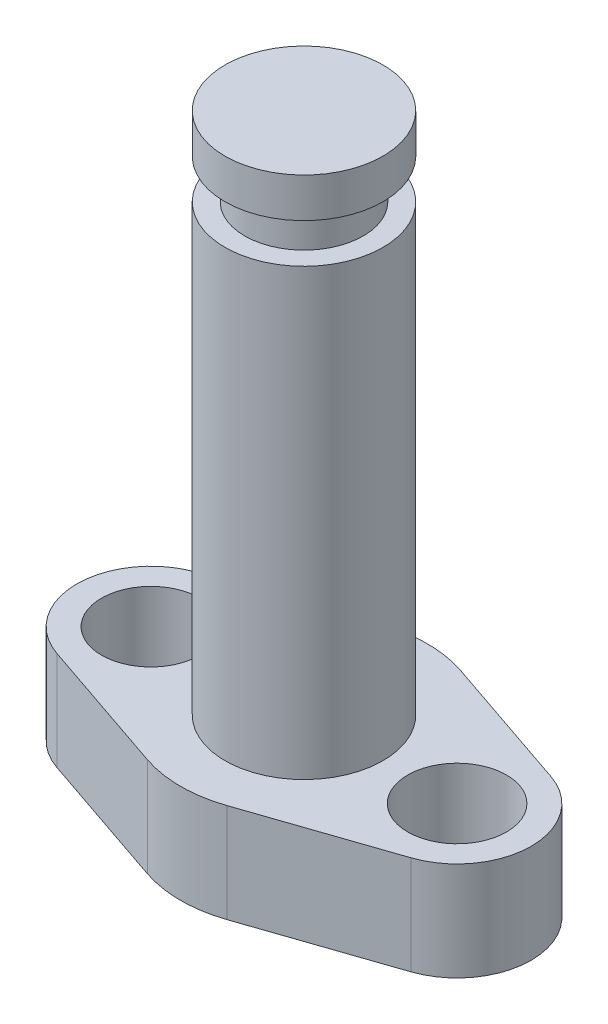
ISO-10303-21;
HEADER;
FILE_DESCRIPTION(('STEP AP214'),'2;1');
FILE_NAME('part.step','',(''),(''),'','','');
FILE_SCHEMA(('AUTOMOTIVE_DESIGN { 1 0 10303 214 1 1 1 1 }'));
ENDSEC;
DATA;
#1=APPLICATION_CONTEXT('core data for automotive mechanical design processes');
#2=APPLICATION_PROTOCOL_DEFINITION('international standard','automotive_design',2000,#1);
#3=PRODUCT_CONTEXT('',#1,'mechanical');
#4=PRODUCT('Part','Part','',(#3));
#5=PRODUCT_RELATED_PRODUCT_CATEGORY('part','',(#4));
#6=PRODUCT_DEFINITION_FORMATION('','',#4);
#7=PRODUCT_DEFINITION_CONTEXT('part definition',#1,'design');
#8=PRODUCT_DEFINITION('design','',#6,#7);
#9=PRODUCT_DEFINITION_SHAPE('','',#8);
#10=(LENGTH_UNIT() NAMED_UNIT(*) SI_UNIT(.MILLI.,.METRE.));
#11=(NAMED_UNIT(*) PLANE_ANGLE_UNIT() SI_UNIT($,.RADIAN.));
#12=(NAMED_UNIT(*) SI_UNIT($,.STERADIAN.) SOLID_ANGLE_UNIT());
#13=UNCERTAINTY_MEASURE_WITH_UNIT(LENGTH_MEASURE(1.E-05),#10,'distance_accuracy_value','');
#14=(GEOMETRIC_REPRESENTATION_CONTEXT(3) GLOBAL_UNCERTAINTY_ASSIGNED_CONTEXT((#13)) GLOBAL_UNIT_ASSIGNED_CONTEXT((#10,
#11,#12)) REPRESENTATION_CONTEXT('',''));
#15=CARTESIAN_POINT('',(0.,0.,0.));
#16=DIRECTION('',(0.,0.,1.));
#17=DIRECTION('',(1.,0.,0.));
#18=AXIS2_PLACEMENT_3D('',#15,#16,#17);
#19=CARTESIAN_POINT('',(-2.01612903225806,5.,5.91588739964565));
#20=DIRECTION('',(0.32258064516129,0.,-0.946541983943304));
#21=DIRECTION('',(-0.946541983943304,0.,-0.32258064516129));
#22=AXIS2_PLACEMENT_3D('',#19,#20,#21);
#23=PLANE('',#22);
#24=DIRECTION('',(0.946541983943304,0.,0.32258064516129));
#25=VECTOR('',#24,1.);
#26=CARTESIAN_POINT('',(-2.01612903225806,0.,5.91588739964565));
#27=LINE('',#26,#25);
#28=CARTESIAN_POINT('',(-8.95967741935484,0.,3.54953243978739));
#29=VERTEX_POINT('',#28);
#30=CARTESIAN_POINT('',(-2.01612903225806,0.,5.91588739964565));
#31=VERTEX_POINT('',#30);
#32=EDGE_CURVE('E140',#29,#31,#27,.T.);
#33=ORIENTED_EDGE('',*,*,#32,.T.);
#34=DIRECTION('',(0.,-1.,0.));
#35=VECTOR('',#34,1.);
#36=CARTESIAN_POINT('',(-2.01612903225806,5.,5.91588739964565));
#37=LINE('',#36,#35);
#38=CARTESIAN_POINT('',(-2.01612903225806,5.,5.91588739964565));
#39=VERTEX_POINT('',#38);
#40=EDGE_CURVE('E39',#39,#31,#37,.T.);
#41=ORIENTED_EDGE('',*,*,#40,.F.);
#42=DIRECTION('',(0.946541983943304,0.,0.32258064516129));
#43=VECTOR('',#42,1.);
#44=CARTESIAN_POINT('',(-2.01612903225806,5.,5.91588739964565));
#45=LINE('',#44,#43);
#46=CARTESIAN_POINT('',(-8.95967741935484,5.,3.54953243978739));
#47=VERTEX_POINT('',#46);
#48=EDGE_CURVE('E191',#47,#39,#45,.T.);
#49=ORIENTED_EDGE('',*,*,#48,.F.);
#50=DIRECTION('',(0.,-1.,0.));
#51=VECTOR('',#50,1.);
#52=CARTESIAN_POINT('',(-8.95967741935484,5.,3.54953243978739));
#53=LINE('',#52,#51);
#54=EDGE_CURVE('E136',#47,#29,#53,.T.);
#55=ORIENTED_EDGE('',*,*,#54,.T.);
#56=EDGE_LOOP('',(#33,#41,#49,#55));
#57=FACE_BOUND('',#56,.T.);
#58=ADVANCED_FACE('F35',(#57),#23,.F.);
#59=CARTESIAN_POINT('',(0.,5.,0.));
#60=DIRECTION('',(0.,-1.,0.));
#61=DIRECTION('',(0.,0.,-1.));
#62=AXIS2_PLACEMENT_3D('',#59,#60,#61);
#63=CYLINDRICAL_SURFACE('',#62,6.25);
#64=CARTESIAN_POINT('',(0.,0.,0.));
#65=DIRECTION('',(0.,1.,0.));
#66=DIRECTION('',(0.,0.,1.));
#67=AXIS2_PLACEMENT_3D('',#64,#65,#66);
#68=CIRCLE('',#67,6.25);
#69=CARTESIAN_POINT('',(2.01612903225806,0.,5.91588739964565));
#70=VERTEX_POINT('',#69);
#71=EDGE_CURVE('E144',#31,#70,#68,.T.);
#72=ORIENTED_EDGE('',*,*,#71,.T.);
#73=DIRECTION('',(0.,-1.,0.));
#74=VECTOR('',#73,1.);
#75=CARTESIAN_POINT('',(2.01612903225806,5.,5.91588739964565));
#76=LINE('',#75,#74);
#77=CARTESIAN_POINT('',(2.01612903225806,5.,5.91588739964565));
#78=VERTEX_POINT('',#77);
#79=EDGE_CURVE('E169',#78,#70,#76,.T.);
#80=ORIENTED_EDGE('',*,*,#79,.F.);
#81=CARTESIAN_POINT('',(0.,5.,0.));
#82=DIRECTION('',(0.,1.,0.));
#83=DIRECTION('',(0.,0.,1.));
#84=AXIS2_PLACEMENT_3D('',#81,#82,#83);
#85=CIRCLE('',#84,6.25);
#86=EDGE_CURVE('E93',#39,#78,#85,.T.);
#87=ORIENTED_EDGE('',*,*,#86,.F.);
#88=ORIENTED_EDGE('',*,*,#40,.T.);
#89=EDGE_LOOP('',(#72,#80,#87,#88));
#90=FACE_BOUND('',#89,.T.);
#91=ADVANCED_FACE('F174',(#90),#63,.T.);
#92=CARTESIAN_POINT('',(2.01612903225806,5.,5.91588739964565));
#93=DIRECTION('',(0.32258064516129,0.,0.946541983943304));
#94=DIRECTION('',(0.946541983943304,0.,-0.32258064516129));
#95=AXIS2_PLACEMENT_3D('',#92,#93,#94);
#96=PLANE('',#95);
#97=DIRECTION('',(-0.946541983943304,0.,0.32258064516129));
#98=VECTOR('',#97,1.);
#99=CARTESIAN_POINT('',(2.01612903225806,0.,5.91588739964565));
#100=LINE('',#99,#98);
#101=CARTESIAN_POINT('',(8.95967741935484,0.,3.54953243978739));
#102=VERTEX_POINT('',#101);
#103=EDGE_CURVE('E147',#102,#70,#100,.T.);
#104=ORIENTED_EDGE('',*,*,#103,.F.);
#105=DIRECTION('',(0.,-1.,0.));
#106=VECTOR('',#105,1.);
#107=CARTESIAN_POINT('',(8.95967741935484,5.,3.54953243978739));
#108=LINE('',#107,#106);
#109=CARTESIAN_POINT('',(8.95967741935484,5.,3.54953243978739));
#110=VERTEX_POINT('',#109);
#111=EDGE_CURVE('E168',#110,#102,#108,.T.);
#112=ORIENTED_EDGE('',*,*,#111,.F.);
#113=DIRECTION('',(-0.946541983943304,0.,0.32258064516129));
#114=VECTOR('',#113,1.);
#115=CARTESIAN_POINT('',(2.01612903225806,5.,5.91588739964565));
#116=LINE('',#115,#114);
#117=EDGE_CURVE('E185',#110,#78,#116,.T.);
#118=ORIENTED_EDGE('',*,*,#117,.T.);
#119=ORIENTED_EDGE('',*,*,#79,.T.);
#120=EDGE_LOOP('',(#104,#112,#118,#119));
#121=FACE_BOUND('',#120,.T.);
#122=ADVANCED_FACE('F182',(#121),#96,.T.);
#123=CARTESIAN_POINT('',(7.75,5.,0.));
#124=DIRECTION('',(0.,-1.,0.));
#125=DIRECTION('',(0.,0.,-1.));
#126=AXIS2_PLACEMENT_3D('',#123,#124,#125);
#127=CYLINDRICAL_SURFACE('',#126,3.75);
#128=CARTESIAN_POINT('',(7.75,0.,0.));
#129=DIRECTION('',(0.,1.,0.));
#130=DIRECTION('',(0.,0.,1.));
#131=AXIS2_PLACEMENT_3D('',#128,#129,#130);
#132=CIRCLE('',#131,3.75);
#133=CARTESIAN_POINT('',(8.95967741935484,0.,-3.54953243978739));
#134=VERTEX_POINT('',#133);
#135=EDGE_CURVE('E150',#102,#134,#132,.T.);
#136=ORIENTED_EDGE('',*,*,#135,.T.);
#137=DIRECTION('',(0.,-1.,0.));
#138=VECTOR('',#137,1.);
#139=CARTESIAN_POINT('',(8.95967741935484,5.,-3.54953243978739));
#140=LINE('',#139,#138);
#141=CARTESIAN_POINT('',(8.95967741935484,5.,-3.54953243978739));
#142=VERTEX_POINT('',#141);
#143=EDGE_CURVE('E166',#142,#134,#140,.T.);
#144=ORIENTED_EDGE('',*,*,#143,.F.);
#145=CARTESIAN_POINT('',(7.75,5.,0.));
#146=DIRECTION('',(0.,1.,0.));
#147=DIRECTION('',(0.,0.,1.));
#148=AXIS2_PLACEMENT_3D('',#145,#146,#147);
#149=CIRCLE('',#148,3.75);
#150=EDGE_CURVE('E188',#110,#142,#149,.T.);
#151=ORIENTED_EDGE('',*,*,#150,.F.);
#152=ORIENTED_EDGE('',*,*,#111,.T.);
#153=EDGE_LOOP('',(#136,#144,#151,#152));
#154=FACE_BOUND('',#153,.T.);
#155=ADVANCED_FACE('F189',(#154),#127,.T.);
#156=CARTESIAN_POINT('',(2.01612903225807,5.,-5.91588739964565));
#157=DIRECTION('',(0.32258064516129,0.,-0.946541983943304));
#158=DIRECTION('',(-0.946541983943304,0.,-0.32258064516129));
#159=AXIS2_PLACEMENT_3D('',#156,#157,#158);
#160=PLANE('',#159);
#161=DIRECTION('',(0.946541983943304,0.,0.32258064516129));
#162=VECTOR('',#161,1.);
#163=CARTESIAN_POINT('',(2.01612903225807,0.,-5.91588739964565));
#164=LINE('',#163,#162);
#165=CARTESIAN_POINT('',(2.01612903225806,0.,-5.91588739964565));
#166=VERTEX_POINT('',#165);
#167=EDGE_CURVE('E153',#166,#134,#164,.T.);
#168=ORIENTED_EDGE('',*,*,#167,.F.);
#169=DIRECTION('',(0.,-1.,0.));
#170=VECTOR('',#169,1.);
#171=CARTESIAN_POINT('',(2.01612903225806,5.,-5.91588739964565));
#172=LINE('',#171,#170);
#173=CARTESIAN_POINT('',(2.01612903225806,5.,-5.91588739964565));
#174=VERTEX_POINT('',#173);
#175=EDGE_CURVE('E125',#174,#166,#172,.T.);
#176=ORIENTED_EDGE('',*,*,#175,.F.);
#177=DIRECTION('',(0.946541983943304,0.,0.32258064516129));
#178=VECTOR('',#177,1.);
#179=CARTESIAN_POINT('',(2.01612903225807,5.,-5.91588739964565));
#180=LINE('',#179,#178);
#181=EDGE_CURVE('E114',#174,#142,#180,.T.);
#182=ORIENTED_EDGE('',*,*,#181,.T.);
#183=ORIENTED_EDGE('',*,*,#143,.T.);
#184=EDGE_LOOP('',(#168,#176,#182,#183));
#185=FACE_BOUND('',#184,.T.);
#186=ADVANCED_FACE('F238',(#185),#160,.T.);
#187=CARTESIAN_POINT('',(-2.01612903225806,0.,-5.91588739964565));
#188=VERTEX_POINT('',#187);
#189=EDGE_CURVE('E121',#166,#188,#68,.T.);
#190=ORIENTED_EDGE('',*,*,#189,.T.);
#191=DIRECTION('',(0.,-1.,0.));
#192=VECTOR('',#191,1.);
#193=CARTESIAN_POINT('',(-2.01612903225806,5.,-5.91588739964565));
#194=LINE('',#193,#192);
#195=CARTESIAN_POINT('',(-2.01612903225806,5.,-5.91588739964565));
#196=VERTEX_POINT('',#195);
#197=EDGE_CURVE('E118',#196,#188,#194,.T.);
#198=ORIENTED_EDGE('',*,*,#197,.F.);
#199=EDGE_CURVE('E107',#174,#196,#85,.T.);
#200=ORIENTED_EDGE('',*,*,#199,.F.);
#201=ORIENTED_EDGE('',*,*,#175,.T.);
#202=EDGE_LOOP('',(#190,#198,#200,#201));
#203=FACE_BOUND('',#202,.T.);
#204=ADVANCED_FACE('F119',(#203),#63,.T.);
#205=CARTESIAN_POINT('',(-2.01612903225807,5.,-5.91588739964565));
#206=DIRECTION('',(-0.32258064516129,0.,-0.946541983943304));
#207=DIRECTION('',(-0.946541983943304,0.,0.32258064516129));
#208=AXIS2_PLACEMENT_3D('',#205,#206,#207);
#209=PLANE('',#208);
#210=DIRECTION('',(0.946541983943304,0.,-0.32258064516129));
#211=VECTOR('',#210,1.);
#212=CARTESIAN_POINT('',(-2.01612903225807,0.,-5.91588739964565));
#213=LINE('',#212,#211);
#214=CARTESIAN_POINT('',(-8.95967741935484,0.,-3.54953243978739));
#215=VERTEX_POINT('',#214);
#216=EDGE_CURVE('E156',#215,#188,#213,.T.);
#217=ORIENTED_EDGE('',*,*,#216,.F.);
#218=DIRECTION('',(0.,-1.,0.));
#219=VECTOR('',#218,1.);
#220=CARTESIAN_POINT('',(-8.95967741935484,5.,-3.54953243978739));
#221=LINE('',#220,#219);
#222=CARTESIAN_POINT('',(-8.95967741935484,5.,-3.54953243978739));
#223=VERTEX_POINT('',#222);
#224=EDGE_CURVE('E81',#223,#215,#221,.T.);
#225=ORIENTED_EDGE('',*,*,#224,.F.);
#226=DIRECTION('',(0.946541983943304,0.,-0.32258064516129));
#227=VECTOR('',#226,1.);
#228=CARTESIAN_POINT('',(-2.01612903225807,5.,-5.91588739964565));
#229=LINE('',#228,#227);
#230=EDGE_CURVE('E112',#223,#196,#229,.T.);
#231=ORIENTED_EDGE('',*,*,#230,.T.);
#232=ORIENTED_EDGE('',*,*,#197,.T.);
#233=EDGE_LOOP('',(#217,#225,#231,#232));
#234=FACE_BOUND('',#233,.T.);
#235=ADVANCED_FACE('F127',(#234),#209,.T.);
#236=CARTESIAN_POINT('',(-7.75,5.,0.));
#237=DIRECTION('',(0.,-1.,0.));
#238=DIRECTION('',(0.,0.,-1.));
#239=AXIS2_PLACEMENT_3D('',#236,#237,#238);
#240=CYLINDRICAL_SURFACE('',#239,3.75);
#241=CARTESIAN_POINT('',(-7.75,0.,0.));
#242=DIRECTION('',(0.,1.,0.));
#243=DIRECTION('',(0.,0.,1.));
#244=AXIS2_PLACEMENT_3D('',#241,#242,#243);
#245=CIRCLE('',#244,3.75);
#246=EDGE_CURVE('E84',#215,#29,#245,.T.);
#247=ORIENTED_EDGE('',*,*,#246,.T.);
#248=ORIENTED_EDGE('',*,*,#54,.F.);
#249=CARTESIAN_POINT('',(-7.75,5.,0.));
#250=DIRECTION('',(0.,1.,0.));
#251=DIRECTION('',(0.,0.,1.));
#252=AXIS2_PLACEMENT_3D('',#249,#250,#251);
#253=CIRCLE('',#252,3.75);
#254=EDGE_CURVE('E53',#223,#47,#253,.T.);
#255=ORIENTED_EDGE('',*,*,#254,.F.);
#256=ORIENTED_EDGE('',*,*,#224,.T.);
#257=EDGE_LOOP('',(#247,#248,#255,#256));
#258=FACE_BOUND('',#257,.T.);
#259=ADVANCED_FACE('F245',(#258),#240,.T.);
#260=CARTESIAN_POINT('',(7.75,5.,0.));
#261=DIRECTION('',(0.,-1.,0.));
#262=DIRECTION('',(0.,0.,-1.));
#263=AXIS2_PLACEMENT_3D('',#260,#261,#262);
#264=CYLINDRICAL_SURFACE('',#263,2.5);
#265=CARTESIAN_POINT('',(7.75,5.,0.));
#266=DIRECTION('',(0.,1.,0.));
#267=DIRECTION('',(0.,0.,1.));
#268=AXIS2_PLACEMENT_3D('',#265,#266,#267);
#269=CIRCLE('',#268,2.5);
#270=CARTESIAN_POINT('',(7.75,5.,2.5));
#271=VERTEX_POINT('',#270);
#272=EDGE_CURVE('E162',#271,#271,#269,.T.);
#273=ORIENTED_EDGE('',*,*,#272,.T.);
#274=EDGE_LOOP('',(#273));
#275=FACE_BOUND('',#274,.T.);
#276=CARTESIAN_POINT('',(7.75,0.,0.));
#277=DIRECTION('',(0.,1.,0.));
#278=DIRECTION('',(0.,0.,1.));
#279=AXIS2_PLACEMENT_3D('',#276,#277,#278);
#280=CIRCLE('',#279,2.5);
#281=CARTESIAN_POINT('',(7.75,0.,2.5));
#282=VERTEX_POINT('',#281);
#283=EDGE_CURVE('E137',#282,#282,#280,.T.);
#284=ORIENTED_EDGE('',*,*,#283,.F.);
#285=EDGE_LOOP('',(#284));
#286=FACE_BOUND('',#285,.T.);
#287=ADVANCED_FACE('F37',(#275,#286),#264,.F.);
#288=CARTESIAN_POINT('',(-7.75,5.,0.));
#289=DIRECTION('',(0.,-1.,0.));
#290=DIRECTION('',(0.,0.,-1.));
#291=AXIS2_PLACEMENT_3D('',#288,#289,#290);
#292=CYLINDRICAL_SURFACE('',#291,2.5);
#293=CARTESIAN_POINT('',(-7.75,5.,0.));
#294=DIRECTION('',(0.,1.,0.));
#295=DIRECTION('',(0.,0.,1.));
#296=AXIS2_PLACEMENT_3D('',#293,#294,#295);
#297=CIRCLE('',#296,2.5);
#298=CARTESIAN_POINT('',(-7.75,5.,2.5));
#299=VERTEX_POINT('',#298);
#300=EDGE_CURVE('E129',#299,#299,#297,.T.);
#301=ORIENTED_EDGE('',*,*,#300,.T.);
#302=EDGE_LOOP('',(#301));
#303=FACE_BOUND('',#302,.T.);
#304=CARTESIAN_POINT('',(-7.75,0.,0.));
#305=DIRECTION('',(0.,1.,0.));
#306=DIRECTION('',(0.,0.,1.));
#307=AXIS2_PLACEMENT_3D('',#304,#305,#306);
#308=CIRCLE('',#307,2.5);
#309=CARTESIAN_POINT('',(-7.75,0.,2.5));
#310=VERTEX_POINT('',#309);
#311=EDGE_CURVE('E159',#310,#310,#308,.T.);
#312=ORIENTED_EDGE('',*,*,#311,.F.);
#313=EDGE_LOOP('',(#312));
#314=FACE_BOUND('',#313,.T.);
#315=ADVANCED_FACE('F248',(#303,#314),#292,.F.);
#316=CARTESIAN_POINT('',(0.,5.,0.));
#317=DIRECTION('',(0.,1.,0.));
#318=DIRECTION('',(0.,0.,1.));
#319=AXIS2_PLACEMENT_3D('',#316,#317,#318);
#320=PLANE('',#319);
#321=CARTESIAN_POINT('',(0.,5.,0.));
#322=DIRECTION('',(0.,1.,0.));
#323=DIRECTION('',(0.,0.,1.));
#324=AXIS2_PLACEMENT_3D('',#321,#322,#323);
#325=CIRCLE('',#324,4.);
#326=CARTESIAN_POINT('',(0.,5.,-4.));
#327=VERTEX_POINT('',#326);
#328=EDGE_CURVE('E196',#327,#327,#325,.T.);
#329=ORIENTED_EDGE('',*,*,#328,.F.);
#330=EDGE_LOOP('',(#329));
#331=FACE_BOUND('',#330,.T.);
#332=ORIENTED_EDGE('',*,*,#272,.F.);
#333=EDGE_LOOP('',(#332));
#334=FACE_BOUND('',#333,.T.);
#335=ORIENTED_EDGE('',*,*,#48,.T.);
#336=ORIENTED_EDGE('',*,*,#86,.T.);
#337=ORIENTED_EDGE('',*,*,#117,.F.);
#338=ORIENTED_EDGE('',*,*,#150,.T.);
#339=ORIENTED_EDGE('',*,*,#181,.F.);
#340=ORIENTED_EDGE('',*,*,#199,.T.);
#341=ORIENTED_EDGE('',*,*,#230,.F.);
#342=ORIENTED_EDGE('',*,*,#254,.T.);
#343=EDGE_LOOP('',(#335,#336,#337,#338,#339,#340,#341,#342));
#344=FACE_BOUND('',#343,.T.);
#345=ORIENTED_EDGE('',*,*,#300,.F.);
#346=EDGE_LOOP('',(#345));
#347=FACE_BOUND('',#346,.T.);
#348=ADVANCED_FACE('F109',(#331,#334,#344,#347),#320,.T.);
#349=CARTESIAN_POINT('',(0.,0.,0.));
#350=DIRECTION('',(0.,1.,0.));
#351=DIRECTION('',(0.,0.,1.));
#352=AXIS2_PLACEMENT_3D('',#349,#350,#351);
#353=PLANE('',#352);
#354=ORIENTED_EDGE('',*,*,#283,.T.);
#355=EDGE_LOOP('',(#354));
#356=FACE_BOUND('',#355,.T.);
#357=ORIENTED_EDGE('',*,*,#32,.F.);
#358=ORIENTED_EDGE('',*,*,#246,.F.);
#359=ORIENTED_EDGE('',*,*,#216,.T.);
#360=ORIENTED_EDGE('',*,*,#189,.F.);
#361=ORIENTED_EDGE('',*,*,#167,.T.);
#362=ORIENTED_EDGE('',*,*,#135,.F.);
#363=ORIENTED_EDGE('',*,*,#103,.T.);
#364=ORIENTED_EDGE('',*,*,#71,.F.);
#365=EDGE_LOOP('',(#357,#358,#359,#360,#361,#362,#363,#364));
#366=FACE_BOUND('',#365,.T.);
#367=ORIENTED_EDGE('',*,*,#311,.T.);
#368=EDGE_LOOP('',(#367));
#369=FACE_BOUND('',#368,.T.);
#370=ADVANCED_FACE('F179',(#356,#366,#369),#353,.F.);
#371=CARTESIAN_POINT('',(0.,27.5,0.));
#372=DIRECTION('',(0.,-1.,0.));
#373=DIRECTION('',(0.,0.,-1.));
#374=AXIS2_PLACEMENT_3D('',#371,#372,#373);
#375=CYLINDRICAL_SURFACE('',#374,4.);
#376=CARTESIAN_POINT('',(0.,27.5,0.));
#377=DIRECTION('',(0.,1.,0.));
#378=DIRECTION('',(0.,0.,1.));
#379=AXIS2_PLACEMENT_3D('',#376,#377,#378);
#380=CIRCLE('',#379,4.);
#381=CARTESIAN_POINT('',(0.,27.5,-4.));
#382=VERTEX_POINT('',#381);
#383=EDGE_CURVE('E141',#382,#382,#380,.T.);
#384=CARTESIAN_POINT('',(0.,27.5,-4.));
#385=CARTESIAN_POINT('',(0.,27.265625,-4.));
#386=CARTESIAN_POINT('',(0.,27.03125,-4.));
#387=CARTESIAN_POINT('',(0.,26.5625,-4.));
#388=CARTESIAN_POINT('',(0.,26.328125,-4.));
#389=CARTESIAN_POINT('',(0.,25.859375,-4.));
#390=CARTESIAN_POINT('',(0.,25.625,-4.));
#391=CARTESIAN_POINT('',(0.,25.15625,-4.));
#392=CARTESIAN_POINT('',(0.,24.921875,-4.));
#393=CARTESIAN_POINT('',(0.,24.453125,-4.));
#394=CARTESIAN_POINT('',(0.,24.21875,-4.));
#395=CARTESIAN_POINT('',(0.,23.75,-4.));
#396=CARTESIAN_POINT('',(0.,23.515625,-4.));
#397=CARTESIAN_POINT('',(0.,23.046875,-4.));
#398=CARTESIAN_POINT('',(0.,22.8125,-4.));
#399=CARTESIAN_POINT('',(0.,22.34375,-4.));
#400=CARTESIAN_POINT('',(0.,22.109375,-4.));
#401=CARTESIAN_POINT('',(0.,21.640625,-4.));
#402=CARTESIAN_POINT('',(0.,21.40625,-4.));
#403=CARTESIAN_POINT('',(0.,20.9375,-4.));
#404=CARTESIAN_POINT('',(0.,20.703125,-4.));
#405=CARTESIAN_POINT('',(0.,20.234375,-4.));
#406=CARTESIAN_POINT('',(0.,20.,-4.));
#407=CARTESIAN_POINT('',(0.,19.53125,-4.));
#408=CARTESIAN_POINT('',(0.,19.296875,-4.));
#409=CARTESIAN_POINT('',(0.,18.828125,-4.));
#410=CARTESIAN_POINT('',(0.,18.59375,-4.));
#411=CARTESIAN_POINT('',(0.,18.125,-4.));
#412=CARTESIAN_POINT('',(0.,17.890625,-4.));
#413=CARTESIAN_POINT('',(0.,17.421875,-4.));
#414=CARTESIAN_POINT('',(0.,17.1875,-4.));
#415=CARTESIAN_POINT('',(0.,16.71875,-4.));
#416=CARTESIAN_POINT('',(0.,16.484375,-4.));
#417=CARTESIAN_POINT('',(0.,16.015625,-4.));
#418=CARTESIAN_POINT('',(0.,15.78125,-4.));
#419=CARTESIAN_POINT('',(0.,15.3125,-4.));
#420=CARTESIAN_POINT('',(0.,15.078125,-4.));
#421=CARTESIAN_POINT('',(0.,14.609375,-4.));
#422=CARTESIAN_POINT('',(0.,14.375,-4.));
#423=CARTESIAN_POINT('',(0.,13.90625,-4.));
#424=CARTESIAN_POINT('',(0.,13.671875,-4.));
#425=CARTESIAN_POINT('',(0.,13.203125,-4.));
#426=CARTESIAN_POINT('',(0.,12.96875,-4.));
#427=CARTESIAN_POINT('',(0.,12.5,-4.));
#428=CARTESIAN_POINT('',(0.,12.265625,-4.));
#429=CARTESIAN_POINT('',(0.,11.796875,-4.));
#430=CARTESIAN_POINT('',(0.,11.5625,-4.));
#431=CARTESIAN_POINT('',(0.,11.09375,-4.));
#432=CARTESIAN_POINT('',(0.,10.859375,-4.));
#433=CARTESIAN_POINT('',(0.,10.390625,-4.));
#434=CARTESIAN_POINT('',(0.,10.15625,-4.));
#435=CARTESIAN_POINT('',(0.,9.6875,-4.));
#436=CARTESIAN_POINT('',(0.,9.453125,-4.));
#437=CARTESIAN_POINT('',(0.,8.984375,-4.));
#438=CARTESIAN_POINT('',(0.,8.75,-4.));
#439=CARTESIAN_POINT('',(0.,8.28125,-4.));
#440=CARTESIAN_POINT('',(0.,8.046875,-4.));
#441=CARTESIAN_POINT('',(0.,7.578125,-4.));
#442=CARTESIAN_POINT('',(0.,7.34375,-4.));
#443=CARTESIAN_POINT('',(0.,6.875,-4.));
#444=CARTESIAN_POINT('',(0.,6.640625,-4.));
#445=CARTESIAN_POINT('',(0.,6.171875,-4.));
#446=CARTESIAN_POINT('',(0.,5.9375,-4.));
#447=CARTESIAN_POINT('',(0.,5.46875,-4.));
#448=CARTESIAN_POINT('',(0.,5.234375,-4.));
#449=CARTESIAN_POINT('',(0.,5.,-4.));
#450=B_SPLINE_CURVE_WITH_KNOTS('',3,(#384,#385,#386,#387,#388,#389,#390,#391,#392,#393,#394,
#395,#396,#397,#398,#399,#400,#401,#402,#403,#404,#405,#406,#407,#408,#409,#410,#411,#412,#413,
#414,#415,#416,#417,#418,#419,#420,#421,#422,#423,#424,#425,#426,#427,#428,#429,#430,#431,#432,
#433,#434,#435,#436,#437,#438,#439,#440,#441,#442,#443,#444,#445,#446,#447,#448,#449),
.UNSPECIFIED.,.F.,.F.,(4,2,2,2,2,2,2,2,2,2,2,2,2,2,2,2,2,2,2,2,2,2,2,2,2,2,2,2,2,2,2,2,4),(0.,
0.703125000000002,1.40625,2.109375,2.8125,3.515625,4.21875,4.921875,5.625,6.328125,7.03125,
7.734375,8.4375,9.140625,9.84375,10.546875,11.25,11.953125,12.65625,13.359375,14.0625,14.765625,
15.46875,16.171875,16.875,17.578125,18.28125,18.984375,19.6875,20.390625,21.09375,21.796875,
22.5),.UNSPECIFIED.);
#451=EDGE_CURVE('BSEAM254',#382,#327,#450,.T.);
#452=ORIENTED_EDGE('',*,*,#383,.F.);
#453=ORIENTED_EDGE('',*,*,#328,.T.);
#454=ORIENTED_EDGE('',*,*,#451,.T.);
#455=ORIENTED_EDGE('',*,*,#451,.F.);
#456=EDGE_LOOP('',(#452,#454,#453,#455));
#457=FACE_BOUND('',#456,.T.);
#458=ADVANCED_FACE('F254',(#457),#375,.T.);
#459=CARTESIAN_POINT('',(0.,27.5,0.));
#460=DIRECTION('',(0.,1.,0.));
#461=DIRECTION('',(0.,0.,1.));
#462=AXIS2_PLACEMENT_3D('',#459,#460,#461);
#463=PLANE('',#462);
#464=CARTESIAN_POINT('',(0.,27.5,0.));
#465=DIRECTION('',(0.,1.,0.));
#466=DIRECTION('',(0.,0.,1.));
#467=AXIS2_PLACEMENT_3D('',#464,#465,#466);
#468=CIRCLE('',#467,3.);
#469=CARTESIAN_POINT('',(0.,27.5,3.));
#470=VERTEX_POINT('',#469);
#471=EDGE_CURVE('E11',#470,#470,#468,.T.);
#472=ORIENTED_EDGE('',*,*,#471,.F.);
#473=EDGE_LOOP('',(#472));
#474=FACE_BOUND('',#473,.T.);
#475=ORIENTED_EDGE('',*,*,#383,.T.);
#476=EDGE_LOOP('',(#475));
#477=FACE_BOUND('',#476,.T.);
#478=ADVANCED_FACE('F261',(#474,#477),#463,.T.);
#479=CARTESIAN_POINT('',(0.,29.5,0.));
#480=DIRECTION('',(0.,-1.,0.));
#481=DIRECTION('',(0.,0.,-1.));
#482=AXIS2_PLACEMENT_3D('',#479,#480,#481);
#483=CYLINDRICAL_SURFACE('',#482,3.);
#484=CARTESIAN_POINT('',(0.,29.5,0.));
#485=DIRECTION('',(0.,1.,0.));
#486=DIRECTION('',(0.,0.,1.));
#487=AXIS2_PLACEMENT_3D('',#484,#485,#486);
#488=CIRCLE('',#487,3.);
#489=CARTESIAN_POINT('',(0.,29.5,3.));
#490=VERTEX_POINT('',#489);
#491=EDGE_CURVE('E199',#490,#490,#488,.T.);
#492=ORIENTED_EDGE('',*,*,#491,.F.);
#493=EDGE_LOOP('',(#492));
#494=FACE_BOUND('',#493,.T.);
#495=ORIENTED_EDGE('',*,*,#471,.T.);
#496=EDGE_LOOP('',(#495));
#497=FACE_BOUND('',#496,.T.);
#498=ADVANCED_FACE('F216',(#494,#497),#483,.T.);
#499=CARTESIAN_POINT('',(0.,31.5,0.));
#500=DIRECTION('',(0.,-1.,0.));
#501=DIRECTION('',(0.,0.,-1.));
#502=AXIS2_PLACEMENT_3D('',#499,#500,#501);
#503=CYLINDRICAL_SURFACE('',#502,4.);
#504=CARTESIAN_POINT('',(0.,31.5,0.));
#505=DIRECTION('',(0.,1.,0.));
#506=DIRECTION('',(0.,0.,1.));
#507=AXIS2_PLACEMENT_3D('',#504,#505,#506);
#508=CIRCLE('',#507,4.);
#509=CARTESIAN_POINT('',(0.,31.5,4.));
#510=VERTEX_POINT('',#509);
#511=EDGE_CURVE('E204',#510,#510,#508,.T.);
#512=ORIENTED_EDGE('',*,*,#511,.F.);
#513=EDGE_LOOP('',(#512));
#514=FACE_BOUND('',#513,.T.);
#515=CARTESIAN_POINT('',(0.,29.5,0.));
#516=DIRECTION('',(0.,1.,0.));
#517=DIRECTION('',(0.,0.,1.));
#518=AXIS2_PLACEMENT_3D('',#515,#516,#517);
#519=CIRCLE('',#518,4.);
#520=CARTESIAN_POINT('',(0.,29.5,4.));
#521=VERTEX_POINT('',#520);
#522=EDGE_CURVE('E205',#521,#521,#519,.T.);
#523=ORIENTED_EDGE('',*,*,#522,.T.);
#524=EDGE_LOOP('',(#523));
#525=FACE_BOUND('',#524,.T.);
#526=ADVANCED_FACE('F213',(#514,#525),#503,.T.);
#527=CARTESIAN_POINT('',(0.,31.5,0.));
#528=DIRECTION('',(0.,1.,0.));
#529=DIRECTION('',(0.,0.,1.));
#530=AXIS2_PLACEMENT_3D('',#527,#528,#529);
#531=PLANE('',#530);
#532=ORIENTED_EDGE('',*,*,#511,.T.);
#533=EDGE_LOOP('',(#532));
#534=FACE_BOUND('',#533,.T.);
#535=ADVANCED_FACE('F211',(#534),#531,.T.);
#536=CARTESIAN_POINT('',(0.,29.5,0.));
#537=DIRECTION('',(0.,1.,0.));
#538=DIRECTION('',(0.,0.,1.));
#539=AXIS2_PLACEMENT_3D('',#536,#537,#538);
#540=PLANE('',#539);
#541=ORIENTED_EDGE('',*,*,#491,.T.);
#542=EDGE_LOOP('',(#541));
#543=FACE_BOUND('',#542,.T.);
#544=ORIENTED_EDGE('',*,*,#522,.F.);
#545=EDGE_LOOP('',(#544));
#546=FACE_BOUND('',#545,.T.);
#547=ADVANCED_FACE('F220',(#543,#546),#540,.F.);
#548=CLOSED_SHELL('',(#58,#91,#122,#155,#186,#204,#235,#259,#287,#315,#348,#370,#458,#478,#498,
#526,#535,#547));
#549=MANIFOLD_SOLID_BREP('B2',#548);
#550=ADVANCED_BREP_SHAPE_REPRESENTATION('',(#18,#549),#14);
#551=SHAPE_DEFINITION_REPRESENTATION(#9,#550);
ENDSEC;
END-ISO-10303-21;
